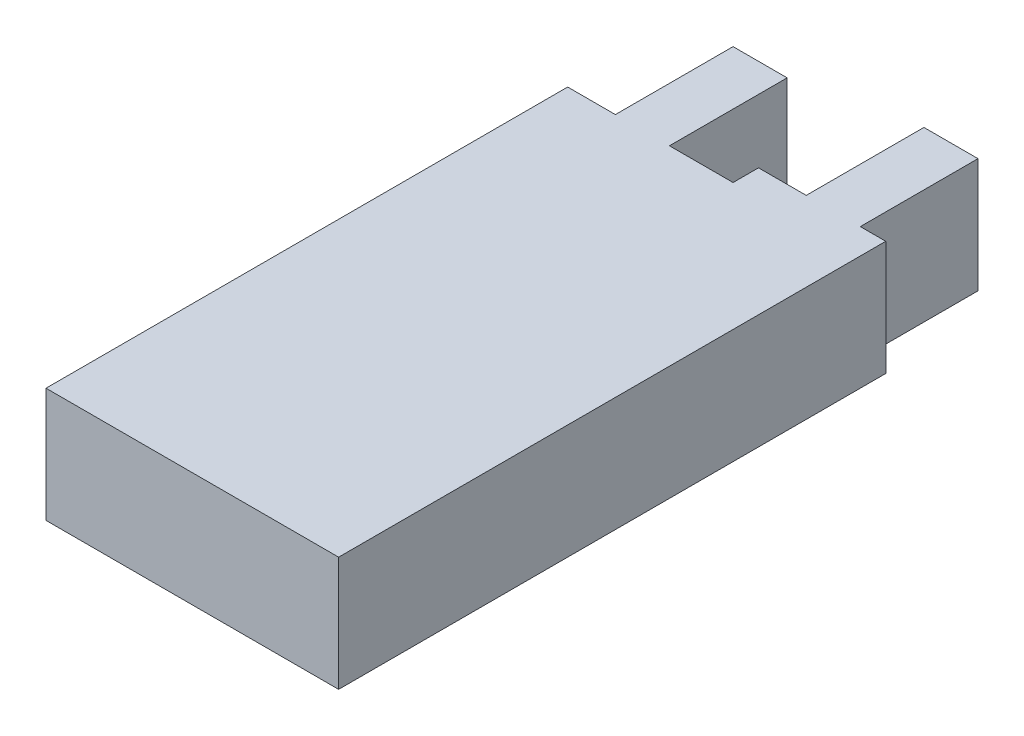
ISO-10303-21;
HEADER;
FILE_DESCRIPTION(('STEP AP214'),'2;1');
FILE_NAME('part.step','',(''),(''),'','','');
FILE_SCHEMA(('AUTOMOTIVE_DESIGN { 1 0 10303 214 1 1 1 1 }'));
ENDSEC;
DATA;
#1=APPLICATION_CONTEXT('core data for automotive mechanical design processes');
#2=APPLICATION_PROTOCOL_DEFINITION('international standard','automotive_design',2000,#1);
#3=PRODUCT_CONTEXT('',#1,'mechanical');
#4=PRODUCT('Part','Part','',(#3));
#5=PRODUCT_RELATED_PRODUCT_CATEGORY('part','',(#4));
#6=PRODUCT_DEFINITION_FORMATION('','',#4);
#7=PRODUCT_DEFINITION_CONTEXT('part definition',#1,'design');
#8=PRODUCT_DEFINITION('design','',#6,#7);
#9=PRODUCT_DEFINITION_SHAPE('','',#8);
#10=(LENGTH_UNIT() NAMED_UNIT(*) SI_UNIT(.MILLI.,.METRE.));
#11=(NAMED_UNIT(*) PLANE_ANGLE_UNIT() SI_UNIT($,.RADIAN.));
#12=(NAMED_UNIT(*) SI_UNIT($,.STERADIAN.) SOLID_ANGLE_UNIT());
#13=UNCERTAINTY_MEASURE_WITH_UNIT(LENGTH_MEASURE(1.E-05),#10,'distance_accuracy_value','');
#14=(GEOMETRIC_REPRESENTATION_CONTEXT(3) GLOBAL_UNCERTAINTY_ASSIGNED_CONTEXT((#13)) GLOBAL_UNIT_ASSIGNED_CONTEXT((#10,
#11,#12)) REPRESENTATION_CONTEXT('',''));
#15=CARTESIAN_POINT('',(0.,0.,0.));
#16=DIRECTION('',(0.,0.,1.));
#17=DIRECTION('',(1.,0.,0.));
#18=AXIS2_PLACEMENT_3D('',#15,#16,#17);
#19=CARTESIAN_POINT('',(-23.,18.,41.));
#20=DIRECTION('',(0.,0.,-1.));
#21=DIRECTION('',(-1.,0.,0.));
#22=AXIS2_PLACEMENT_3D('',#19,#20,#21);
#23=PLANE('',#22);
#24=DIRECTION('',(1.,0.,0.));
#25=VECTOR('',#24,1.);
#26=CARTESIAN_POINT('',(-23.,0.,41.));
#27=LINE('',#26,#25);
#28=CARTESIAN_POINT('',(-23.,0.,41.));
#29=VERTEX_POINT('',#28);
#30=CARTESIAN_POINT('',(23.,0.,41.));
#31=VERTEX_POINT('',#30);
#32=EDGE_CURVE('E165',#29,#31,#27,.T.);
#33=ORIENTED_EDGE('',*,*,#32,.T.);
#34=DIRECTION('',(0.,-1.,0.));
#35=VECTOR('',#34,1.);
#36=CARTESIAN_POINT('',(23.,18.,41.));
#37=LINE('',#36,#35);
#38=CARTESIAN_POINT('',(23.,18.,41.));
#39=VERTEX_POINT('',#38);
#40=EDGE_CURVE('E11',#39,#31,#37,.T.);
#41=ORIENTED_EDGE('',*,*,#40,.F.);
#42=DIRECTION('',(1.,0.,0.));
#43=VECTOR('',#42,1.);
#44=CARTESIAN_POINT('',(-23.,18.,41.));
#45=LINE('',#44,#43);
#46=CARTESIAN_POINT('',(-23.,18.,41.));
#47=VERTEX_POINT('',#46);
#48=EDGE_CURVE('E191',#47,#39,#45,.T.);
#49=ORIENTED_EDGE('',*,*,#48,.F.);
#50=DIRECTION('',(0.,-1.,0.));
#51=VECTOR('',#50,1.);
#52=CARTESIAN_POINT('',(-23.,18.,41.));
#53=LINE('',#52,#51);
#54=EDGE_CURVE('E161',#47,#29,#53,.T.);
#55=ORIENTED_EDGE('',*,*,#54,.T.);
#56=EDGE_LOOP('',(#33,#41,#49,#55));
#57=FACE_BOUND('',#56,.T.);
#58=ADVANCED_FACE('F33',(#57),#23,.F.);
#59=CARTESIAN_POINT('',(23.,18.,41.));
#60=DIRECTION('',(-1.,0.,0.));
#61=DIRECTION('',(0.,0.,1.));
#62=AXIS2_PLACEMENT_3D('',#59,#60,#61);
#63=PLANE('',#62);
#64=DIRECTION('',(0.,0.,-1.));
#65=VECTOR('',#64,1.);
#66=CARTESIAN_POINT('',(23.,0.,41.));
#67=LINE('',#66,#65);
#68=CARTESIAN_POINT('',(23.,0.,-45.));
#69=VERTEX_POINT('',#68);
#70=EDGE_CURVE('E168',#31,#69,#67,.T.);
#71=ORIENTED_EDGE('',*,*,#70,.T.);
#72=DIRECTION('',(0.,-1.,0.));
#73=VECTOR('',#72,1.);
#74=CARTESIAN_POINT('',(23.,18.,-45.));
#75=LINE('',#74,#73);
#76=CARTESIAN_POINT('',(23.,18.,-45.));
#77=VERTEX_POINT('',#76);
#78=EDGE_CURVE('E41',#77,#69,#75,.T.);
#79=ORIENTED_EDGE('',*,*,#78,.F.);
#80=DIRECTION('',(0.,0.,-1.));
#81=VECTOR('',#80,1.);
#82=CARTESIAN_POINT('',(23.,18.,41.));
#83=LINE('',#82,#81);
#84=EDGE_CURVE('E110',#39,#77,#83,.T.);
#85=ORIENTED_EDGE('',*,*,#84,.F.);
#86=ORIENTED_EDGE('',*,*,#40,.T.);
#87=EDGE_LOOP('',(#71,#79,#85,#86));
#88=FACE_BOUND('',#87,.T.);
#89=ADVANCED_FACE('F279',(#88),#63,.F.);
#90=CARTESIAN_POINT('',(19.,18.,-45.));
#91=DIRECTION('',(0.,0.,1.));
#92=DIRECTION('',(1.,0.,0.));
#93=AXIS2_PLACEMENT_3D('',#90,#91,#92);
#94=PLANE('',#93);
#95=DIRECTION('',(-1.,0.,0.));
#96=VECTOR('',#95,1.);
#97=CARTESIAN_POINT('',(19.,0.,-45.));
#98=LINE('',#97,#96);
#99=CARTESIAN_POINT('',(19.,0.,-45.));
#100=VERTEX_POINT('',#99);
#101=EDGE_CURVE('E170',#69,#100,#98,.T.);
#102=ORIENTED_EDGE('',*,*,#101,.T.);
#103=DIRECTION('',(0.,-1.,0.));
#104=VECTOR('',#103,1.);
#105=CARTESIAN_POINT('',(19.,18.,-45.));
#106=LINE('',#105,#104);
#107=CARTESIAN_POINT('',(19.,18.,-45.));
#108=VERTEX_POINT('',#107);
#109=EDGE_CURVE('E216',#108,#100,#106,.T.);
#110=ORIENTED_EDGE('',*,*,#109,.F.);
#111=DIRECTION('',(-1.,0.,0.));
#112=VECTOR('',#111,1.);
#113=CARTESIAN_POINT('',(19.,18.,-45.));
#114=LINE('',#113,#112);
#115=EDGE_CURVE('E224',#77,#108,#114,.T.);
#116=ORIENTED_EDGE('',*,*,#115,.F.);
#117=ORIENTED_EDGE('',*,*,#78,.T.);
#118=EDGE_LOOP('',(#102,#110,#116,#117));
#119=FACE_BOUND('',#118,.T.);
#120=ADVANCED_FACE('F222',(#119),#94,.F.);
#121=CARTESIAN_POINT('',(19.,18.,-63.5));
#122=DIRECTION('',(-1.,0.,0.));
#123=DIRECTION('',(0.,0.,1.));
#124=AXIS2_PLACEMENT_3D('',#121,#122,#123);
#125=PLANE('',#124);
#126=DIRECTION('',(0.,0.,-1.));
#127=VECTOR('',#126,1.);
#128=CARTESIAN_POINT('',(19.,0.,-63.5));
#129=LINE('',#128,#127);
#130=CARTESIAN_POINT('',(19.,0.,-63.5));
#131=VERTEX_POINT('',#130);
#132=EDGE_CURVE('E172',#100,#131,#129,.T.);
#133=ORIENTED_EDGE('',*,*,#132,.T.);
#134=DIRECTION('',(0.,-1.,0.));
#135=VECTOR('',#134,1.);
#136=CARTESIAN_POINT('',(19.,18.,-63.5));
#137=LINE('',#136,#135);
#138=CARTESIAN_POINT('',(19.,18.,-63.5));
#139=VERTEX_POINT('',#138);
#140=EDGE_CURVE('E213',#139,#131,#137,.T.);
#141=ORIENTED_EDGE('',*,*,#140,.F.);
#142=DIRECTION('',(0.,0.,-1.));
#143=VECTOR('',#142,1.);
#144=CARTESIAN_POINT('',(19.,18.,-63.5));
#145=LINE('',#144,#143);
#146=EDGE_CURVE('E242',#108,#139,#145,.T.);
#147=ORIENTED_EDGE('',*,*,#146,.F.);
#148=ORIENTED_EDGE('',*,*,#109,.T.);
#149=EDGE_LOOP('',(#133,#141,#147,#148));
#150=FACE_BOUND('',#149,.T.);
#151=ADVANCED_FACE('F233',(#150),#125,.F.);
#152=CARTESIAN_POINT('',(10.5,18.,-63.5));
#153=DIRECTION('',(0.,0.,1.));
#154=DIRECTION('',(1.,0.,0.));
#155=AXIS2_PLACEMENT_3D('',#152,#153,#154);
#156=PLANE('',#155);
#157=DIRECTION('',(-1.,0.,0.));
#158=VECTOR('',#157,1.);
#159=CARTESIAN_POINT('',(10.5,0.,-63.5));
#160=LINE('',#159,#158);
#161=CARTESIAN_POINT('',(10.5,0.,-63.5));
#162=VERTEX_POINT('',#161);
#163=EDGE_CURVE('E174',#131,#162,#160,.T.);
#164=ORIENTED_EDGE('',*,*,#163,.T.);
#165=DIRECTION('',(0.,-1.,0.));
#166=VECTOR('',#165,1.);
#167=CARTESIAN_POINT('',(10.5,18.,-63.5));
#168=LINE('',#167,#166);
#169=CARTESIAN_POINT('',(10.5,18.,-63.5));
#170=VERTEX_POINT('',#169);
#171=EDGE_CURVE('E210',#170,#162,#168,.T.);
#172=ORIENTED_EDGE('',*,*,#171,.F.);
#173=DIRECTION('',(-1.,0.,0.));
#174=VECTOR('',#173,1.);
#175=CARTESIAN_POINT('',(10.5,18.,-63.5));
#176=LINE('',#175,#174);
#177=EDGE_CURVE('E239',#139,#170,#176,.T.);
#178=ORIENTED_EDGE('',*,*,#177,.F.);
#179=ORIENTED_EDGE('',*,*,#140,.T.);
#180=EDGE_LOOP('',(#164,#172,#178,#179));
#181=FACE_BOUND('',#180,.T.);
#182=ADVANCED_FACE('F237',(#181),#156,.F.);
#183=CARTESIAN_POINT('',(10.5,18.,-45.));
#184=DIRECTION('',(1.,0.,0.));
#185=DIRECTION('',(0.,0.,-1.));
#186=AXIS2_PLACEMENT_3D('',#183,#184,#185);
#187=PLANE('',#186);
#188=DIRECTION('',(0.,0.,1.));
#189=VECTOR('',#188,1.);
#190=CARTESIAN_POINT('',(10.5,0.,-45.));
#191=LINE('',#190,#189);
#192=CARTESIAN_POINT('',(10.5,0.,-45.));
#193=VERTEX_POINT('',#192);
#194=EDGE_CURVE('E176',#162,#193,#191,.T.);
#195=ORIENTED_EDGE('',*,*,#194,.T.);
#196=DIRECTION('',(0.,-1.,0.));
#197=VECTOR('',#196,1.);
#198=CARTESIAN_POINT('',(10.5,18.,-45.));
#199=LINE('',#198,#197);
#200=CARTESIAN_POINT('',(10.5,18.,-45.));
#201=VERTEX_POINT('',#200);
#202=EDGE_CURVE('E207',#201,#193,#199,.T.);
#203=ORIENTED_EDGE('',*,*,#202,.F.);
#204=DIRECTION('',(0.,0.,1.));
#205=VECTOR('',#204,1.);
#206=CARTESIAN_POINT('',(10.5,18.,-45.));
#207=LINE('',#206,#205);
#208=EDGE_CURVE('E241',#170,#201,#207,.T.);
#209=ORIENTED_EDGE('',*,*,#208,.F.);
#210=ORIENTED_EDGE('',*,*,#171,.T.);
#211=EDGE_LOOP('',(#195,#203,#209,#210));
#212=FACE_BOUND('',#211,.T.);
#213=ADVANCED_FACE('F292',(#212),#187,.F.);
#214=CARTESIAN_POINT('',(2.99999999999999,18.,-45.));
#215=DIRECTION('',(0.,0.,1.));
#216=DIRECTION('',(1.,0.,0.));
#217=AXIS2_PLACEMENT_3D('',#214,#215,#216);
#218=PLANE('',#217);
#219=DIRECTION('',(-1.,0.,0.));
#220=VECTOR('',#219,1.);
#221=CARTESIAN_POINT('',(2.99999999999999,0.,-45.));
#222=LINE('',#221,#220);
#223=CARTESIAN_POINT('',(2.99999999999999,0.,-45.));
#224=VERTEX_POINT('',#223);
#225=EDGE_CURVE('E178',#193,#224,#222,.T.);
#226=ORIENTED_EDGE('',*,*,#225,.T.);
#227=DIRECTION('',(0.,-1.,0.));
#228=VECTOR('',#227,1.);
#229=CARTESIAN_POINT('',(2.99999999999999,18.,-45.));
#230=LINE('',#229,#228);
#231=CARTESIAN_POINT('',(2.99999999999999,18.,-45.));
#232=VERTEX_POINT('',#231);
#233=EDGE_CURVE('E204',#232,#224,#230,.T.);
#234=ORIENTED_EDGE('',*,*,#233,.F.);
#235=DIRECTION('',(-1.,0.,0.));
#236=VECTOR('',#235,1.);
#237=CARTESIAN_POINT('',(2.99999999999999,18.,-45.));
#238=LINE('',#237,#236);
#239=EDGE_CURVE('E244',#201,#232,#238,.T.);
#240=ORIENTED_EDGE('',*,*,#239,.F.);
#241=ORIENTED_EDGE('',*,*,#202,.T.);
#242=EDGE_LOOP('',(#226,#234,#240,#241));
#243=FACE_BOUND('',#242,.T.);
#244=ADVANCED_FACE('F295',(#243),#218,.F.);
#245=CARTESIAN_POINT('',(2.99999999999999,18.,-41.));
#246=DIRECTION('',(1.,0.,0.));
#247=DIRECTION('',(0.,0.,-1.));
#248=AXIS2_PLACEMENT_3D('',#245,#246,#247);
#249=PLANE('',#248);
#250=DIRECTION('',(0.,0.,1.));
#251=VECTOR('',#250,1.);
#252=CARTESIAN_POINT('',(2.99999999999999,0.,-41.));
#253=LINE('',#252,#251);
#254=CARTESIAN_POINT('',(2.99999999999999,0.,-41.));
#255=VERTEX_POINT('',#254);
#256=EDGE_CURVE('E180',#224,#255,#253,.T.);
#257=ORIENTED_EDGE('',*,*,#256,.T.);
#258=DIRECTION('',(0.,-1.,0.));
#259=VECTOR('',#258,1.);
#260=CARTESIAN_POINT('',(2.99999999999999,18.,-41.));
#261=LINE('',#260,#259);
#262=CARTESIAN_POINT('',(2.99999999999999,18.,-41.));
#263=VERTEX_POINT('',#262);
#264=EDGE_CURVE('E201',#263,#255,#261,.T.);
#265=ORIENTED_EDGE('',*,*,#264,.F.);
#266=DIRECTION('',(0.,0.,1.));
#267=VECTOR('',#266,1.);
#268=CARTESIAN_POINT('',(2.99999999999999,18.,-41.));
#269=LINE('',#268,#267);
#270=EDGE_CURVE('E250',#232,#263,#269,.T.);
#271=ORIENTED_EDGE('',*,*,#270,.F.);
#272=ORIENTED_EDGE('',*,*,#233,.T.);
#273=EDGE_LOOP('',(#257,#265,#271,#272));
#274=FACE_BOUND('',#273,.T.);
#275=ADVANCED_FACE('F299',(#274),#249,.F.);
#276=CARTESIAN_POINT('',(-7.,18.,-41.));
#277=DIRECTION('',(0.,0.,1.));
#278=DIRECTION('',(1.,0.,0.));
#279=AXIS2_PLACEMENT_3D('',#276,#277,#278);
#280=PLANE('',#279);
#281=DIRECTION('',(-1.,0.,0.));
#282=VECTOR('',#281,1.);
#283=CARTESIAN_POINT('',(-7.,0.,-41.));
#284=LINE('',#283,#282);
#285=CARTESIAN_POINT('',(-7.,0.,-41.));
#286=VERTEX_POINT('',#285);
#287=EDGE_CURVE('E182',#255,#286,#284,.T.);
#288=ORIENTED_EDGE('',*,*,#287,.T.);
#289=DIRECTION('',(0.,-1.,0.));
#290=VECTOR('',#289,1.);
#291=CARTESIAN_POINT('',(-7.,18.,-41.));
#292=LINE('',#291,#290);
#293=CARTESIAN_POINT('',(-7.,18.,-41.));
#294=VERTEX_POINT('',#293);
#295=EDGE_CURVE('E198',#294,#286,#292,.T.);
#296=ORIENTED_EDGE('',*,*,#295,.F.);
#297=DIRECTION('',(-1.,0.,0.));
#298=VECTOR('',#297,1.);
#299=CARTESIAN_POINT('',(-7.,18.,-41.));
#300=LINE('',#299,#298);
#301=EDGE_CURVE('E252',#263,#294,#300,.T.);
#302=ORIENTED_EDGE('',*,*,#301,.F.);
#303=ORIENTED_EDGE('',*,*,#264,.T.);
#304=EDGE_LOOP('',(#288,#296,#302,#303));
#305=FACE_BOUND('',#304,.T.);
#306=ADVANCED_FACE('F303',(#305),#280,.F.);
#307=CARTESIAN_POINT('',(-7.00000000000001,18.,-59.5));
#308=DIRECTION('',(-1.,0.,0.));
#309=DIRECTION('',(0.,0.,1.));
#310=AXIS2_PLACEMENT_3D('',#307,#308,#309);
#311=PLANE('',#310);
#312=DIRECTION('',(0.,0.,-1.));
#313=VECTOR('',#312,1.);
#314=CARTESIAN_POINT('',(-7.00000000000001,0.,-59.5));
#315=LINE('',#314,#313);
#316=CARTESIAN_POINT('',(-7.00000000000001,0.,-59.5));
#317=VERTEX_POINT('',#316);
#318=EDGE_CURVE('E184',#286,#317,#315,.T.);
#319=ORIENTED_EDGE('',*,*,#318,.T.);
#320=DIRECTION('',(0.,-1.,0.));
#321=VECTOR('',#320,1.);
#322=CARTESIAN_POINT('',(-7.00000000000001,18.,-59.5));
#323=LINE('',#322,#321);
#324=CARTESIAN_POINT('',(-7.00000000000001,18.,-59.5));
#325=VERTEX_POINT('',#324);
#326=EDGE_CURVE('E195',#325,#317,#323,.T.);
#327=ORIENTED_EDGE('',*,*,#326,.F.);
#328=DIRECTION('',(0.,0.,-1.));
#329=VECTOR('',#328,1.);
#330=CARTESIAN_POINT('',(-7.00000000000001,18.,-59.5));
#331=LINE('',#330,#329);
#332=EDGE_CURVE('E254',#294,#325,#331,.T.);
#333=ORIENTED_EDGE('',*,*,#332,.F.);
#334=ORIENTED_EDGE('',*,*,#295,.T.);
#335=EDGE_LOOP('',(#319,#327,#333,#334));
#336=FACE_BOUND('',#335,.T.);
#337=ADVANCED_FACE('F260',(#336),#311,.F.);
#338=CARTESIAN_POINT('',(-15.5,18.,-59.5));
#339=DIRECTION('',(0.,0.,1.));
#340=DIRECTION('',(1.,0.,0.));
#341=AXIS2_PLACEMENT_3D('',#338,#339,#340);
#342=PLANE('',#341);
#343=DIRECTION('',(-1.,0.,0.));
#344=VECTOR('',#343,1.);
#345=CARTESIAN_POINT('',(-15.5,0.,-59.5));
#346=LINE('',#345,#344);
#347=CARTESIAN_POINT('',(-15.5,0.,-59.5));
#348=VERTEX_POINT('',#347);
#349=EDGE_CURVE('E186',#317,#348,#346,.T.);
#350=ORIENTED_EDGE('',*,*,#349,.T.);
#351=DIRECTION('',(0.,-1.,0.));
#352=VECTOR('',#351,1.);
#353=CARTESIAN_POINT('',(-15.5,18.,-59.5));
#354=LINE('',#353,#352);
#355=CARTESIAN_POINT('',(-15.5,18.,-59.5));
#356=VERTEX_POINT('',#355);
#357=EDGE_CURVE('E156',#356,#348,#354,.T.);
#358=ORIENTED_EDGE('',*,*,#357,.F.);
#359=DIRECTION('',(-1.,0.,0.));
#360=VECTOR('',#359,1.);
#361=CARTESIAN_POINT('',(-15.5,18.,-59.5));
#362=LINE('',#361,#360);
#363=EDGE_CURVE('E147',#325,#356,#362,.T.);
#364=ORIENTED_EDGE('',*,*,#363,.F.);
#365=ORIENTED_EDGE('',*,*,#326,.T.);
#366=EDGE_LOOP('',(#350,#358,#364,#365));
#367=FACE_BOUND('',#366,.T.);
#368=ADVANCED_FACE('F264',(#367),#342,.F.);
#369=CARTESIAN_POINT('',(-15.5,18.,-41.));
#370=DIRECTION('',(1.,0.,0.));
#371=DIRECTION('',(0.,0.,-1.));
#372=AXIS2_PLACEMENT_3D('',#369,#370,#371);
#373=PLANE('',#372);
#374=DIRECTION('',(0.,0.,1.));
#375=VECTOR('',#374,1.);
#376=CARTESIAN_POINT('',(-15.5,0.,-41.));
#377=LINE('',#376,#375);
#378=CARTESIAN_POINT('',(-15.5,0.,-41.));
#379=VERTEX_POINT('',#378);
#380=EDGE_CURVE('E155',#348,#379,#377,.T.);
#381=ORIENTED_EDGE('',*,*,#380,.T.);
#382=DIRECTION('',(0.,-1.,0.));
#383=VECTOR('',#382,1.);
#384=CARTESIAN_POINT('',(-15.5,18.,-41.));
#385=LINE('',#384,#383);
#386=CARTESIAN_POINT('',(-15.5,18.,-41.));
#387=VERTEX_POINT('',#386);
#388=EDGE_CURVE('E152',#387,#379,#385,.T.);
#389=ORIENTED_EDGE('',*,*,#388,.F.);
#390=DIRECTION('',(0.,0.,1.));
#391=VECTOR('',#390,1.);
#392=CARTESIAN_POINT('',(-15.5,18.,-41.));
#393=LINE('',#392,#391);
#394=EDGE_CURVE('E141',#356,#387,#393,.T.);
#395=ORIENTED_EDGE('',*,*,#394,.F.);
#396=ORIENTED_EDGE('',*,*,#357,.T.);
#397=EDGE_LOOP('',(#381,#389,#395,#396));
#398=FACE_BOUND('',#397,.T.);
#399=ADVANCED_FACE('F153',(#398),#373,.F.);
#400=CARTESIAN_POINT('',(-23.,18.,-41.));
#401=DIRECTION('',(0.,0.,1.));
#402=DIRECTION('',(1.,0.,0.));
#403=AXIS2_PLACEMENT_3D('',#400,#401,#402);
#404=PLANE('',#403);
#405=DIRECTION('',(-1.,0.,0.));
#406=VECTOR('',#405,1.);
#407=CARTESIAN_POINT('',(-23.,0.,-41.));
#408=LINE('',#407,#406);
#409=CARTESIAN_POINT('',(-23.,0.,-41.));
#410=VERTEX_POINT('',#409);
#411=EDGE_CURVE('E96',#379,#410,#408,.T.);
#412=ORIENTED_EDGE('',*,*,#411,.T.);
#413=DIRECTION('',(0.,-1.,0.));
#414=VECTOR('',#413,1.);
#415=CARTESIAN_POINT('',(-23.,18.,-41.));
#416=LINE('',#415,#414);
#417=CARTESIAN_POINT('',(-23.,18.,-41.));
#418=VERTEX_POINT('',#417);
#419=EDGE_CURVE('E157',#418,#410,#416,.T.);
#420=ORIENTED_EDGE('',*,*,#419,.F.);
#421=DIRECTION('',(-1.,0.,0.));
#422=VECTOR('',#421,1.);
#423=CARTESIAN_POINT('',(-23.,18.,-41.));
#424=LINE('',#423,#422);
#425=EDGE_CURVE('E145',#387,#418,#424,.T.);
#426=ORIENTED_EDGE('',*,*,#425,.F.);
#427=ORIENTED_EDGE('',*,*,#388,.T.);
#428=EDGE_LOOP('',(#412,#420,#426,#427));
#429=FACE_BOUND('',#428,.T.);
#430=ADVANCED_FACE('F159',(#429),#404,.F.);
#431=CARTESIAN_POINT('',(-23.,18.,-41.));
#432=DIRECTION('',(1.,0.,0.));
#433=DIRECTION('',(0.,0.,-1.));
#434=AXIS2_PLACEMENT_3D('',#431,#432,#433);
#435=PLANE('',#434);
#436=DIRECTION('',(0.,0.,1.));
#437=VECTOR('',#436,1.);
#438=CARTESIAN_POINT('',(-23.,0.,-41.));
#439=LINE('',#438,#437);
#440=EDGE_CURVE('E102',#410,#29,#439,.T.);
#441=ORIENTED_EDGE('',*,*,#440,.T.);
#442=ORIENTED_EDGE('',*,*,#54,.F.);
#443=DIRECTION('',(0.,0.,1.));
#444=VECTOR('',#443,1.);
#445=CARTESIAN_POINT('',(-23.,18.,-41.));
#446=LINE('',#445,#444);
#447=EDGE_CURVE('E49',#418,#47,#446,.T.);
#448=ORIENTED_EDGE('',*,*,#447,.F.);
#449=ORIENTED_EDGE('',*,*,#419,.T.);
#450=EDGE_LOOP('',(#441,#442,#448,#449));
#451=FACE_BOUND('',#450,.T.);
#452=ADVANCED_FACE('F268',(#451),#435,.F.);
#453=CARTESIAN_POINT('',(0.,18.,0.));
#454=DIRECTION('',(0.,1.,0.));
#455=DIRECTION('',(0.,0.,1.));
#456=AXIS2_PLACEMENT_3D('',#453,#454,#455);
#457=PLANE('',#456);
#458=ORIENTED_EDGE('',*,*,#48,.T.);
#459=ORIENTED_EDGE('',*,*,#84,.T.);
#460=ORIENTED_EDGE('',*,*,#115,.T.);
#461=ORIENTED_EDGE('',*,*,#146,.T.);
#462=ORIENTED_EDGE('',*,*,#177,.T.);
#463=ORIENTED_EDGE('',*,*,#208,.T.);
#464=ORIENTED_EDGE('',*,*,#239,.T.);
#465=ORIENTED_EDGE('',*,*,#270,.T.);
#466=ORIENTED_EDGE('',*,*,#301,.T.);
#467=ORIENTED_EDGE('',*,*,#332,.T.);
#468=ORIENTED_EDGE('',*,*,#363,.T.);
#469=ORIENTED_EDGE('',*,*,#394,.T.);
#470=ORIENTED_EDGE('',*,*,#425,.T.);
#471=ORIENTED_EDGE('',*,*,#447,.T.);
#472=EDGE_LOOP('',(#458,#459,#460,#461,#462,#463,#464,#465,#466,#467,#468,#469,#470,#471));
#473=FACE_BOUND('',#472,.T.);
#474=ADVANCED_FACE('F143',(#473),#457,.T.);
#475=CARTESIAN_POINT('',(0.,0.,0.));
#476=DIRECTION('',(0.,1.,0.));
#477=DIRECTION('',(0.,0.,1.));
#478=AXIS2_PLACEMENT_3D('',#475,#476,#477);
#479=PLANE('',#478);
#480=ORIENTED_EDGE('',*,*,#32,.F.);
#481=ORIENTED_EDGE('',*,*,#440,.F.);
#482=ORIENTED_EDGE('',*,*,#411,.F.);
#483=ORIENTED_EDGE('',*,*,#380,.F.);
#484=ORIENTED_EDGE('',*,*,#349,.F.);
#485=ORIENTED_EDGE('',*,*,#318,.F.);
#486=ORIENTED_EDGE('',*,*,#287,.F.);
#487=ORIENTED_EDGE('',*,*,#256,.F.);
#488=ORIENTED_EDGE('',*,*,#225,.F.);
#489=ORIENTED_EDGE('',*,*,#194,.F.);
#490=ORIENTED_EDGE('',*,*,#163,.F.);
#491=ORIENTED_EDGE('',*,*,#132,.F.);
#492=ORIENTED_EDGE('',*,*,#101,.F.);
#493=ORIENTED_EDGE('',*,*,#70,.F.);
#494=EDGE_LOOP('',(#480,#481,#482,#483,#484,#485,#486,#487,#488,#489,#490,#491,#492,#493));
#495=FACE_BOUND('',#494,.T.);
#496=ADVANCED_FACE('F228',(#495),#479,.F.);
#497=CLOSED_SHELL('',(#58,#89,#120,#151,#182,#213,#244,#275,#306,#337,#368,#399,#430,#452,#474,#496));
#498=MANIFOLD_SOLID_BREP('B2',#497);
#499=ADVANCED_BREP_SHAPE_REPRESENTATION('',(#18,#498),#14);
#500=SHAPE_DEFINITION_REPRESENTATION(#9,#499);
ENDSEC;
END-ISO-10303-21;
